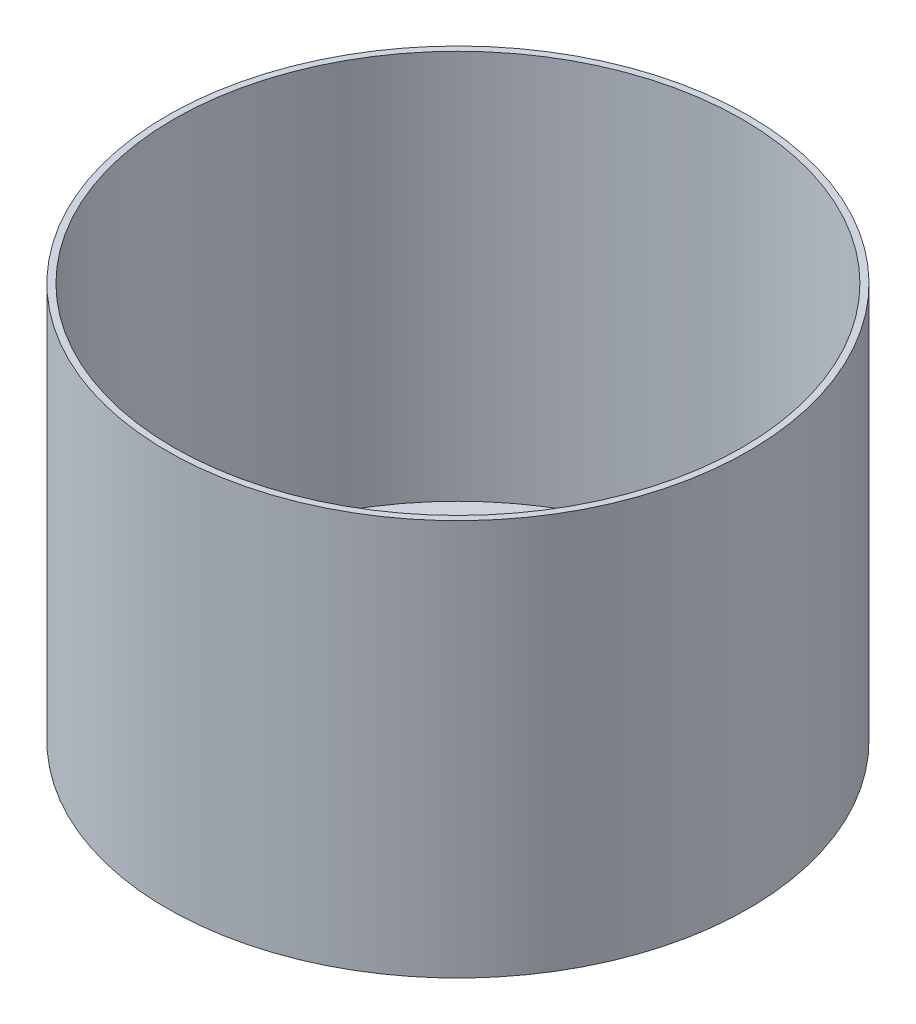
ISO-10303-21;
HEADER;
FILE_DESCRIPTION(('STEP AP214'),'2;1');
FILE_NAME('part.step','',(''),(''),'','','');
FILE_SCHEMA(('AUTOMOTIVE_DESIGN { 1 0 10303 214 1 1 1 1 }'));
ENDSEC;
DATA;
#1=APPLICATION_CONTEXT('core data for automotive mechanical design processes');
#2=APPLICATION_PROTOCOL_DEFINITION('international standard','automotive_design',2000,#1);
#3=PRODUCT_CONTEXT('',#1,'mechanical');
#4=PRODUCT('Part','Part','',(#3));
#5=PRODUCT_RELATED_PRODUCT_CATEGORY('part','',(#4));
#6=PRODUCT_DEFINITION_FORMATION('','',#4);
#7=PRODUCT_DEFINITION_CONTEXT('part definition',#1,'design');
#8=PRODUCT_DEFINITION('design','',#6,#7);
#9=PRODUCT_DEFINITION_SHAPE('','',#8);
#10=(LENGTH_UNIT() NAMED_UNIT(*) SI_UNIT(.MILLI.,.METRE.));
#11=(NAMED_UNIT(*) PLANE_ANGLE_UNIT() SI_UNIT($,.RADIAN.));
#12=(NAMED_UNIT(*) SI_UNIT($,.STERADIAN.) SOLID_ANGLE_UNIT());
#13=UNCERTAINTY_MEASURE_WITH_UNIT(LENGTH_MEASURE(1.E-05),#10,'distance_accuracy_value','');
#14=(GEOMETRIC_REPRESENTATION_CONTEXT(3) GLOBAL_UNCERTAINTY_ASSIGNED_CONTEXT((#13)) GLOBAL_UNIT_ASSIGNED_CONTEXT((#10,
#11,#12)) REPRESENTATION_CONTEXT('',''));
#15=CARTESIAN_POINT('',(0.,0.,0.));
#16=DIRECTION('',(0.,0.,1.));
#17=DIRECTION('',(1.,0.,0.));
#18=AXIS2_PLACEMENT_3D('',#15,#16,#17);
#19=CARTESIAN_POINT('',(112.649,-77.46,0.));
#20=DIRECTION('',(0.,1.,0.));
#21=DIRECTION('',(0.,0.,1.));
#22=AXIS2_PLACEMENT_3D('',#19,#20,#21);
#23=PLANE('',#22);
#24=CARTESIAN_POINT('',(0.,-77.46,0.));
#25=DIRECTION('',(0.,-1.,0.));
#26=DIRECTION('',(0.,0.,-1.));
#27=AXIS2_PLACEMENT_3D('',#24,#25,#26);
#28=CIRCLE('',#27,112.649);
#29=CARTESIAN_POINT('',(0.,-77.46,-112.649));
#30=VERTEX_POINT('',#29);
#31=EDGE_CURVE('E42',#30,#30,#28,.T.);
#32=ORIENTED_EDGE('',*,*,#31,.F.);
#33=EDGE_LOOP('',(#32));
#34=FACE_BOUND('',#33,.T.);
#35=CARTESIAN_POINT('',(-95.25,-77.46,0.));
#36=DIRECTION('',(0.,1.,0.));
#37=DIRECTION('',(0.,0.,1.));
#38=AXIS2_PLACEMENT_3D('',#35,#36,#37);
#39=CIRCLE('',#38,4.7625);
#40=CARTESIAN_POINT('',(-95.25,-77.46,4.7625));
#41=VERTEX_POINT('',#40);
#42=EDGE_CURVE('E77',#41,#41,#39,.F.);
#43=ORIENTED_EDGE('',*,*,#42,.T.);
#44=EDGE_LOOP('',(#43));
#45=FACE_BOUND('',#44,.T.);
#46=CARTESIAN_POINT('',(0.,-77.46,-95.25));
#47=DIRECTION('',(0.,1.,0.));
#48=DIRECTION('',(0.,0.,1.));
#49=AXIS2_PLACEMENT_3D('',#46,#47,#48);
#50=CIRCLE('',#49,4.7625);
#51=CARTESIAN_POINT('',(0.,-77.46,-90.4875));
#52=VERTEX_POINT('',#51);
#53=EDGE_CURVE('E66',#52,#52,#50,.F.);
#54=ORIENTED_EDGE('',*,*,#53,.T.);
#55=EDGE_LOOP('',(#54));
#56=FACE_BOUND('',#55,.T.);
#57=CARTESIAN_POINT('',(95.2499999999999,-77.46,0.));
#58=DIRECTION('',(0.,1.,0.));
#59=DIRECTION('',(0.,0.,1.));
#60=AXIS2_PLACEMENT_3D('',#57,#58,#59);
#61=CIRCLE('',#60,4.76250000000001);
#62=CARTESIAN_POINT('',(95.2499999999999,-77.46,4.76250000000001));
#63=VERTEX_POINT('',#62);
#64=EDGE_CURVE('E65',#63,#63,#61,.F.);
#65=ORIENTED_EDGE('',*,*,#64,.T.);
#66=EDGE_LOOP('',(#65));
#67=FACE_BOUND('',#66,.T.);
#68=CARTESIAN_POINT('',(0.,-77.46,95.25));
#69=DIRECTION('',(0.,1.,0.));
#70=DIRECTION('',(0.,0.,1.));
#71=AXIS2_PLACEMENT_3D('',#68,#69,#70);
#72=CIRCLE('',#71,4.7625);
#73=CARTESIAN_POINT('',(0.,-77.46,100.0125));
#74=VERTEX_POINT('',#73);
#75=EDGE_CURVE('E59',#74,#74,#72,.F.);
#76=ORIENTED_EDGE('',*,*,#75,.T.);
#77=EDGE_LOOP('',(#76));
#78=FACE_BOUND('',#77,.T.);
#79=CARTESIAN_POINT('',(0.,-77.46,0.));
#80=DIRECTION('',(0.,1.,0.));
#81=DIRECTION('',(0.,0.,1.));
#82=AXIS2_PLACEMENT_3D('',#79,#80,#81);
#83=CIRCLE('',#82,25.4);
#84=CARTESIAN_POINT('',(0.,-77.46,25.4));
#85=VERTEX_POINT('',#84);
#86=EDGE_CURVE('E56',#85,#85,#83,.F.);
#87=ORIENTED_EDGE('',*,*,#86,.T.);
#88=EDGE_LOOP('',(#87));
#89=FACE_BOUND('',#88,.T.);
#90=ADVANCED_FACE('F35',(#34,#45,#56,#67,#78,#89),#23,.T.);
#91=CARTESIAN_POINT('',(0.,0.,0.));
#92=DIRECTION('',(0.,-1.,0.));
#93=DIRECTION('',(0.,0.,-1.));
#94=AXIS2_PLACEMENT_3D('',#91,#92,#93);
#95=CYLINDRICAL_SURFACE('',#94,115.189);
#96=CARTESIAN_POINT('',(0.,76.972,0.));
#97=DIRECTION('',(0.,-1.,0.));
#98=DIRECTION('',(0.,0.,-1.));
#99=AXIS2_PLACEMENT_3D('',#96,#97,#98);
#100=CIRCLE('',#99,115.189);
#101=CARTESIAN_POINT('',(0.,76.972,-115.189));
#102=VERTEX_POINT('',#101);
#103=EDGE_CURVE('E50',#102,#102,#100,.T.);
#104=ORIENTED_EDGE('',*,*,#103,.T.);
#105=EDGE_LOOP('',(#104));
#106=FACE_BOUND('',#105,.T.);
#107=CARTESIAN_POINT('',(0.,-80.,0.));
#108=DIRECTION('',(0.,-1.,0.));
#109=DIRECTION('',(0.,0.,-1.));
#110=AXIS2_PLACEMENT_3D('',#107,#108,#109);
#111=CIRCLE('',#110,115.189);
#112=CARTESIAN_POINT('',(0.,-80.,-115.189));
#113=VERTEX_POINT('',#112);
#114=EDGE_CURVE('E10',#113,#113,#111,.T.);
#115=ORIENTED_EDGE('',*,*,#114,.F.);
#116=EDGE_LOOP('',(#115));
#117=FACE_BOUND('',#116,.T.);
#118=ADVANCED_FACE('F37',(#106,#117),#95,.T.);
#119=CARTESIAN_POINT('',(115.189,-80.,0.));
#120=DIRECTION('',(0.,-1.,0.));
#121=DIRECTION('',(0.,0.,-1.));
#122=AXIS2_PLACEMENT_3D('',#119,#120,#121);
#123=PLANE('',#122);
#124=CARTESIAN_POINT('',(0.,-80.,95.25));
#125=DIRECTION('',(0.,-1.,0.));
#126=DIRECTION('',(0.,0.,-1.));
#127=AXIS2_PLACEMENT_3D('',#124,#125,#126);
#128=CIRCLE('',#127,4.7625);
#129=CARTESIAN_POINT('',(0.,-80.,90.4875));
#130=VERTEX_POINT('',#129);
#131=EDGE_CURVE('E69',#130,#130,#128,.T.);
#132=ORIENTED_EDGE('',*,*,#131,.F.);
#133=EDGE_LOOP('',(#132));
#134=FACE_BOUND('',#133,.T.);
#135=CARTESIAN_POINT('',(95.2499999999999,-80.,0.));
#136=DIRECTION('',(0.,-1.,0.));
#137=DIRECTION('',(0.,0.,-1.));
#138=AXIS2_PLACEMENT_3D('',#135,#136,#137);
#139=CIRCLE('',#138,4.76250000000001);
#140=CARTESIAN_POINT('',(95.2499999999999,-80.,-4.76250000000001));
#141=VERTEX_POINT('',#140);
#142=EDGE_CURVE('E62',#141,#141,#139,.T.);
#143=ORIENTED_EDGE('',*,*,#142,.F.);
#144=EDGE_LOOP('',(#143));
#145=FACE_BOUND('',#144,.T.);
#146=CARTESIAN_POINT('',(0.,-80.,-95.25));
#147=DIRECTION('',(0.,-1.,0.));
#148=DIRECTION('',(0.,0.,-1.));
#149=AXIS2_PLACEMENT_3D('',#146,#147,#148);
#150=CIRCLE('',#149,4.7625);
#151=CARTESIAN_POINT('',(0.,-80.,-100.0125));
#152=VERTEX_POINT('',#151);
#153=EDGE_CURVE('E80',#152,#152,#150,.T.);
#154=ORIENTED_EDGE('',*,*,#153,.F.);
#155=EDGE_LOOP('',(#154));
#156=FACE_BOUND('',#155,.T.);
#157=CARTESIAN_POINT('',(-95.25,-80.,0.));
#158=DIRECTION('',(0.,-1.,0.));
#159=DIRECTION('',(0.,0.,-1.));
#160=AXIS2_PLACEMENT_3D('',#157,#158,#159);
#161=CIRCLE('',#160,4.7625);
#162=CARTESIAN_POINT('',(-95.25,-80.,-4.7625));
#163=VERTEX_POINT('',#162);
#164=EDGE_CURVE('E74',#163,#163,#161,.T.);
#165=ORIENTED_EDGE('',*,*,#164,.F.);
#166=EDGE_LOOP('',(#165));
#167=FACE_BOUND('',#166,.T.);
#168=CARTESIAN_POINT('',(0.,-80.,0.));
#169=DIRECTION('',(0.,-1.,0.));
#170=DIRECTION('',(0.,0.,-1.));
#171=AXIS2_PLACEMENT_3D('',#168,#169,#170);
#172=CIRCLE('',#171,25.4);
#173=CARTESIAN_POINT('',(0.,-80.,-25.4));
#174=VERTEX_POINT('',#173);
#175=EDGE_CURVE('E55',#174,#174,#172,.T.);
#176=ORIENTED_EDGE('',*,*,#175,.F.);
#177=EDGE_LOOP('',(#176));
#178=FACE_BOUND('',#177,.T.);
#179=ORIENTED_EDGE('',*,*,#114,.T.);
#180=EDGE_LOOP('',(#179));
#181=FACE_BOUND('',#180,.T.);
#182=ADVANCED_FACE('F96',(#134,#145,#156,#167,#178,#181),#123,.T.);
#183=CARTESIAN_POINT('',(0.,0.,0.));
#184=DIRECTION('',(0.,-1.,0.));
#185=DIRECTION('',(0.,0.,-1.));
#186=AXIS2_PLACEMENT_3D('',#183,#184,#185);
#187=CYLINDRICAL_SURFACE('',#186,112.649);
#188=ORIENTED_EDGE('',*,*,#31,.T.);
#189=EDGE_LOOP('',(#188));
#190=FACE_BOUND('',#189,.T.);
#191=CARTESIAN_POINT('',(0.,76.972,0.));
#192=DIRECTION('',(0.,-1.,0.));
#193=DIRECTION('',(0.,0.,-1.));
#194=AXIS2_PLACEMENT_3D('',#191,#192,#193);
#195=CIRCLE('',#194,112.649);
#196=CARTESIAN_POINT('',(0.,76.972,-112.649));
#197=VERTEX_POINT('',#196);
#198=EDGE_CURVE('E46',#197,#197,#195,.T.);
#199=ORIENTED_EDGE('',*,*,#198,.F.);
#200=EDGE_LOOP('',(#199));
#201=FACE_BOUND('',#200,.T.);
#202=ADVANCED_FACE('F99',(#190,#201),#187,.F.);
#203=CARTESIAN_POINT('',(112.649,76.972,0.));
#204=DIRECTION('',(0.,1.,0.));
#205=DIRECTION('',(0.,0.,1.));
#206=AXIS2_PLACEMENT_3D('',#203,#204,#205);
#207=PLANE('',#206);
#208=ORIENTED_EDGE('',*,*,#198,.T.);
#209=EDGE_LOOP('',(#208));
#210=FACE_BOUND('',#209,.T.);
#211=ORIENTED_EDGE('',*,*,#103,.F.);
#212=EDGE_LOOP('',(#211));
#213=FACE_BOUND('',#212,.T.);
#214=ADVANCED_FACE('F128',(#210,#213),#207,.T.);
#215=CARTESIAN_POINT('',(-95.25,76.973,0.));
#216=DIRECTION('',(0.,-1.,0.));
#217=DIRECTION('',(0.,0.,-1.));
#218=AXIS2_PLACEMENT_3D('',#215,#216,#217);
#219=CYLINDRICAL_SURFACE('',#218,4.7625);
#220=ORIENTED_EDGE('',*,*,#42,.F.);
#221=EDGE_LOOP('',(#220));
#222=FACE_BOUND('',#221,.T.);
#223=ORIENTED_EDGE('',*,*,#164,.T.);
#224=EDGE_LOOP('',(#223));
#225=FACE_BOUND('',#224,.T.);
#226=ADVANCED_FACE('F92',(#222,#225),#219,.F.);
#227=CARTESIAN_POINT('',(0.,76.973,-95.25));
#228=DIRECTION('',(0.,-1.,0.));
#229=DIRECTION('',(0.,0.,-1.));
#230=AXIS2_PLACEMENT_3D('',#227,#228,#229);
#231=CYLINDRICAL_SURFACE('',#230,4.7625);
#232=ORIENTED_EDGE('',*,*,#53,.F.);
#233=EDGE_LOOP('',(#232));
#234=FACE_BOUND('',#233,.T.);
#235=ORIENTED_EDGE('',*,*,#153,.T.);
#236=EDGE_LOOP('',(#235));
#237=FACE_BOUND('',#236,.T.);
#238=ADVANCED_FACE('F88',(#234,#237),#231,.F.);
#239=CARTESIAN_POINT('',(95.2499999999999,76.973,0.));
#240=DIRECTION('',(0.,-1.,0.));
#241=DIRECTION('',(0.,0.,-1.));
#242=AXIS2_PLACEMENT_3D('',#239,#240,#241);
#243=CYLINDRICAL_SURFACE('',#242,4.76250000000001);
#244=ORIENTED_EDGE('',*,*,#64,.F.);
#245=EDGE_LOOP('',(#244));
#246=FACE_BOUND('',#245,.T.);
#247=ORIENTED_EDGE('',*,*,#142,.T.);
#248=EDGE_LOOP('',(#247));
#249=FACE_BOUND('',#248,.T.);
#250=ADVANCED_FACE('F91',(#246,#249),#243,.F.);
#251=CARTESIAN_POINT('',(0.,76.973,95.25));
#252=DIRECTION('',(0.,-1.,0.));
#253=DIRECTION('',(0.,0.,-1.));
#254=AXIS2_PLACEMENT_3D('',#251,#252,#253);
#255=CYLINDRICAL_SURFACE('',#254,4.7625);
#256=ORIENTED_EDGE('',*,*,#75,.F.);
#257=EDGE_LOOP('',(#256));
#258=FACE_BOUND('',#257,.T.);
#259=ORIENTED_EDGE('',*,*,#131,.T.);
#260=EDGE_LOOP('',(#259));
#261=FACE_BOUND('',#260,.T.);
#262=ADVANCED_FACE('F107',(#258,#261),#255,.F.);
#263=CARTESIAN_POINT('',(0.,76.973,0.));
#264=DIRECTION('',(0.,-1.,0.));
#265=DIRECTION('',(0.,0.,-1.));
#266=AXIS2_PLACEMENT_3D('',#263,#264,#265);
#267=CYLINDRICAL_SURFACE('',#266,25.4);
#268=ORIENTED_EDGE('',*,*,#86,.F.);
#269=EDGE_LOOP('',(#268));
#270=FACE_BOUND('',#269,.T.);
#271=ORIENTED_EDGE('',*,*,#175,.T.);
#272=EDGE_LOOP('',(#271));
#273=FACE_BOUND('',#272,.T.);
#274=ADVANCED_FACE('F105',(#270,#273),#267,.F.);
#275=CLOSED_SHELL('',(#90,#118,#182,#202,#214,#226,#238,#250,#262,#274));
#276=MANIFOLD_SOLID_BREP('B2',#275);
#277=ADVANCED_BREP_SHAPE_REPRESENTATION('',(#18,#276),#14);
#278=SHAPE_DEFINITION_REPRESENTATION(#9,#277);
ENDSEC;
END-ISO-10303-21;
